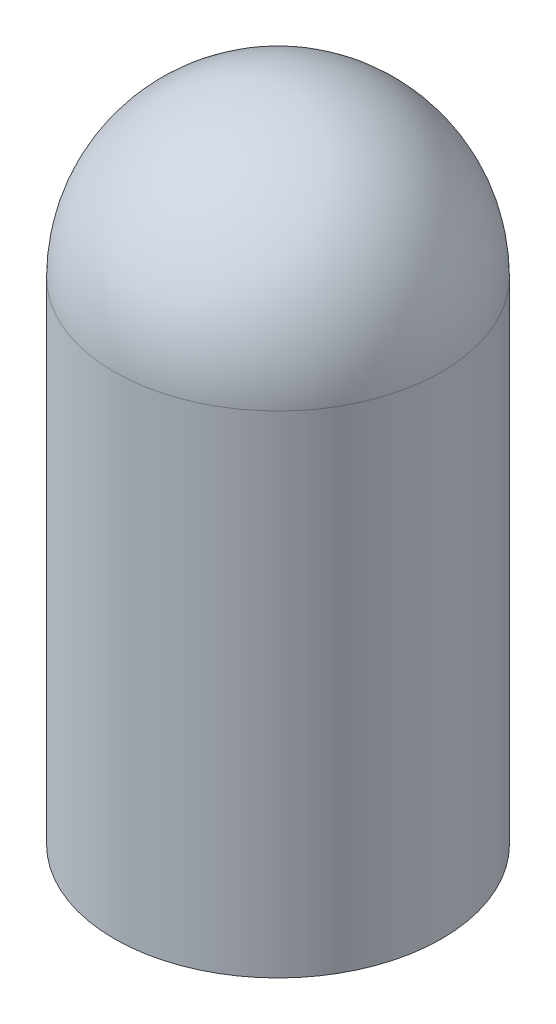
ISO-10303-21;
HEADER;
FILE_DESCRIPTION(('STEP AP214'),'2;1');
FILE_NAME('part.step','',(''),(''),'','','');
FILE_SCHEMA(('AUTOMOTIVE_DESIGN { 1 0 10303 214 1 1 1 1 }'));
ENDSEC;
DATA;
#1=APPLICATION_CONTEXT('core data for automotive mechanical design processes');
#2=APPLICATION_PROTOCOL_DEFINITION('international standard','automotive_design',2000,#1);
#3=PRODUCT_CONTEXT('',#1,'mechanical');
#4=PRODUCT('Part','Part','',(#3));
#5=PRODUCT_RELATED_PRODUCT_CATEGORY('part','',(#4));
#6=PRODUCT_DEFINITION_FORMATION('','',#4);
#7=PRODUCT_DEFINITION_CONTEXT('part definition',#1,'design');
#8=PRODUCT_DEFINITION('design','',#6,#7);
#9=PRODUCT_DEFINITION_SHAPE('','',#8);
#10=(LENGTH_UNIT() NAMED_UNIT(*) SI_UNIT(.MILLI.,.METRE.));
#11=(NAMED_UNIT(*) PLANE_ANGLE_UNIT() SI_UNIT($,.RADIAN.));
#12=(NAMED_UNIT(*) SI_UNIT($,.STERADIAN.) SOLID_ANGLE_UNIT());
#13=UNCERTAINTY_MEASURE_WITH_UNIT(LENGTH_MEASURE(1.E-05),#10,'distance_accuracy_value','');
#14=(GEOMETRIC_REPRESENTATION_CONTEXT(3) GLOBAL_UNCERTAINTY_ASSIGNED_CONTEXT((#13)) GLOBAL_UNIT_ASSIGNED_CONTEXT((#10,
#11,#12)) REPRESENTATION_CONTEXT('',''));
#15=CARTESIAN_POINT('',(0.,0.,0.));
#16=DIRECTION('',(0.,0.,1.));
#17=DIRECTION('',(1.,0.,0.));
#18=AXIS2_PLACEMENT_3D('',#15,#16,#17);
#19=CARTESIAN_POINT('',(0.,20.,0.));
#20=DIRECTION('',(0.,-1.,0.));
#21=DIRECTION('',(0.,0.,-1.));
#22=AXIS2_PLACEMENT_3D('',#19,#20,#21);
#23=CYLINDRICAL_SURFACE('',#22,5.);
#24=CARTESIAN_POINT('',(0.,15.,0.));
#25=DIRECTION('',(0.,-1.,0.));
#26=DIRECTION('',(0.,0.,-1.));
#27=AXIS2_PLACEMENT_3D('',#24,#25,#26);
#28=CIRCLE('',#27,5.);
#29=CARTESIAN_POINT('',(0.,15.,-5.));
#30=VERTEX_POINT('',#29);
#31=EDGE_CURVE('E10',#30,#30,#28,.T.);
#32=ORIENTED_EDGE('',*,*,#31,.T.);
#33=EDGE_LOOP('',(#32));
#34=FACE_BOUND('',#33,.T.);
#35=CARTESIAN_POINT('',(0.,0.,0.));
#36=DIRECTION('',(0.,1.,0.));
#37=DIRECTION('',(0.,0.,1.));
#38=AXIS2_PLACEMENT_3D('',#35,#36,#37);
#39=CIRCLE('',#38,5.);
#40=CARTESIAN_POINT('',(0.,0.,5.));
#41=VERTEX_POINT('',#40);
#42=EDGE_CURVE('E45',#41,#41,#39,.T.);
#43=ORIENTED_EDGE('',*,*,#42,.T.);
#44=EDGE_LOOP('',(#43));
#45=FACE_BOUND('',#44,.T.);
#46=ADVANCED_FACE('F37',(#34,#45),#23,.T.);
#47=CARTESIAN_POINT('',(0.,0.,0.));
#48=DIRECTION('',(0.,1.,0.));
#49=DIRECTION('',(0.,0.,1.));
#50=AXIS2_PLACEMENT_3D('',#47,#48,#49);
#51=PLANE('',#50);
#52=ORIENTED_EDGE('',*,*,#42,.F.);
#53=EDGE_LOOP('',(#52));
#54=FACE_BOUND('',#53,.T.);
#55=ADVANCED_FACE('F53',(#54),#51,.F.);
#56=CARTESIAN_POINT('',(0.,15.,0.));
#57=DIRECTION('',(0.,1.,0.));
#58=DIRECTION('',(0.,0.,1.));
#59=AXIS2_PLACEMENT_3D('',#56,#57,#58);
#60=SPHERICAL_SURFACE('',#59,5.);
#61=ORIENTED_EDGE('',*,*,#31,.F.);
#62=EDGE_LOOP('',(#61));
#63=FACE_BOUND('',#62,.T.);
#64=ADVANCED_FACE('F39',(#63),#60,.T.);
#65=CLOSED_SHELL('',(#46,#55,#64));
#66=MANIFOLD_SOLID_BREP('B2',#65);
#67=ADVANCED_BREP_SHAPE_REPRESENTATION('',(#18,#66),#14);
#68=SHAPE_DEFINITION_REPRESENTATION(#9,#67);
ENDSEC;
END-ISO-10303-21;
